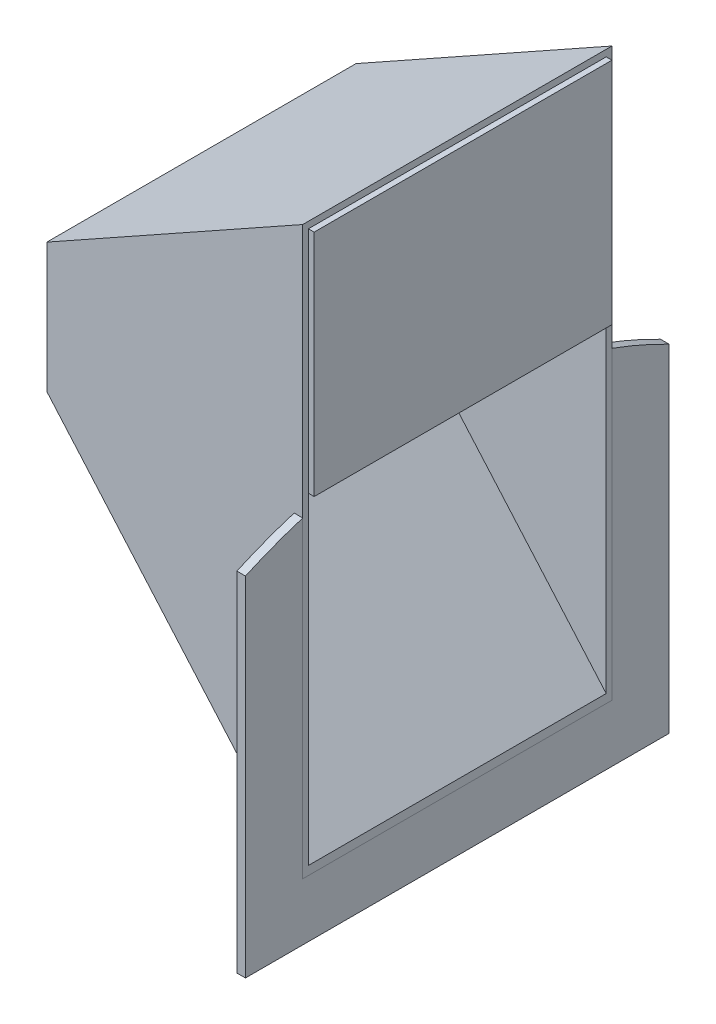
ISO-10303-21;
HEADER;
FILE_DESCRIPTION(('STEP AP214'),'2;1');
FILE_NAME('part.step','',(''),(''),'','','');
FILE_SCHEMA(('AUTOMOTIVE_DESIGN { 1 0 10303 214 1 1 1 1 }'));
ENDSEC;
DATA;
#1=APPLICATION_CONTEXT('core data for automotive mechanical design processes');
#2=APPLICATION_PROTOCOL_DEFINITION('international standard','automotive_design',2000,#1);
#3=PRODUCT_CONTEXT('',#1,'mechanical');
#4=PRODUCT('Part','Part','',(#3));
#5=PRODUCT_RELATED_PRODUCT_CATEGORY('part','',(#4));
#6=PRODUCT_DEFINITION_FORMATION('','',#4);
#7=PRODUCT_DEFINITION_CONTEXT('part definition',#1,'design');
#8=PRODUCT_DEFINITION('design','',#6,#7);
#9=PRODUCT_DEFINITION_SHAPE('','',#8);
#10=(LENGTH_UNIT() NAMED_UNIT(*) SI_UNIT(.MILLI.,.METRE.));
#11=(NAMED_UNIT(*) PLANE_ANGLE_UNIT() SI_UNIT($,.RADIAN.));
#12=(NAMED_UNIT(*) SI_UNIT($,.STERADIAN.) SOLID_ANGLE_UNIT());
#13=UNCERTAINTY_MEASURE_WITH_UNIT(LENGTH_MEASURE(1.E-05),#10,'distance_accuracy_value','');
#14=(GEOMETRIC_REPRESENTATION_CONTEXT(3) GLOBAL_UNCERTAINTY_ASSIGNED_CONTEXT((#13)) GLOBAL_UNIT_ASSIGNED_CONTEXT((#10,
#11,#12)) REPRESENTATION_CONTEXT('',''));
#15=CARTESIAN_POINT('',(0.,0.,0.));
#16=DIRECTION('',(0.,0.,1.));
#17=DIRECTION('',(1.,0.,0.));
#18=AXIS2_PLACEMENT_3D('',#15,#16,#17);
#19=CARTESIAN_POINT('',(-3.,16.5557235333864,0.));
#20=DIRECTION('',(0.,0.,1.));
#21=DIRECTION('',(1.,0.,0.));
#22=AXIS2_PLACEMENT_3D('',#19,#20,#21);
#23=PLANE('',#22);
#24=DIRECTION('',(0.,-1.,0.));
#25=VECTOR('',#24,1.);
#26=CARTESIAN_POINT('',(0.,16.5557235333864,0.));
#27=LINE('',#26,#25);
#28=CARTESIAN_POINT('',(0.,123.025196008159,0.));
#29=VERTEX_POINT('',#28);
#30=CARTESIAN_POINT('',(0.,16.5557235333864,0.));
#31=VERTEX_POINT('',#30);
#32=EDGE_CURVE('E143',#29,#31,#27,.T.);
#33=ORIENTED_EDGE('',*,*,#32,.F.);
#34=DIRECTION('',(1.,0.,0.));
#35=VECTOR('',#34,1.);
#36=CARTESIAN_POINT('',(-3.,123.025196008159,0.));
#37=LINE('',#36,#35);
#38=CARTESIAN_POINT('',(-3.,123.025196008159,0.));
#39=VERTEX_POINT('',#38);
#40=EDGE_CURVE('E12',#39,#29,#37,.T.);
#41=ORIENTED_EDGE('',*,*,#40,.F.);
#42=DIRECTION('',(0.,-1.,0.));
#43=VECTOR('',#42,1.);
#44=CARTESIAN_POINT('',(-3.,16.5557235333864,0.));
#45=LINE('',#44,#43);
#46=CARTESIAN_POINT('',(-3.,16.5557235333864,0.));
#47=VERTEX_POINT('',#46);
#48=EDGE_CURVE('E163',#39,#47,#45,.T.);
#49=ORIENTED_EDGE('',*,*,#48,.T.);
#50=DIRECTION('',(1.,0.,0.));
#51=VECTOR('',#50,1.);
#52=CARTESIAN_POINT('',(-3.,16.5557235333864,0.));
#53=LINE('',#52,#51);
#54=EDGE_CURVE('E49',#47,#31,#53,.T.);
#55=ORIENTED_EDGE('',*,*,#54,.T.);
#56=EDGE_LOOP('',(#33,#41,#49,#55));
#57=FACE_BOUND('',#56,.T.);
#58=ADVANCED_FACE('F46',(#57),#23,.T.);
#59=CARTESIAN_POINT('',(-3.,-36.7746788353462,58.));
#60=DIRECTION('',(1.,0.,0.));
#61=DIRECTION('',(0.,0.,-1.));
#62=AXIS2_PLACEMENT_3D('',#59,#60,#61);
#63=CYLINDRICAL_SURFACE('',#62,170.);
#64=CARTESIAN_POINT('',(0.,-36.7746788353462,58.));
#65=DIRECTION('',(1.,0.,0.));
#66=DIRECTION('',(0.,0.,-1.));
#67=AXIS2_PLACEMENT_3D('',#64,#65,#66);
#68=CIRCLE('',#67,170.);
#69=CARTESIAN_POINT('',(0.,114.274981872647,-20.));
#70=VERTEX_POINT('',#69);
#71=EDGE_CURVE('E161',#70,#29,#68,.T.);
#72=ORIENTED_EDGE('',*,*,#71,.F.);
#73=DIRECTION('',(1.,0.,0.));
#74=VECTOR('',#73,1.);
#75=CARTESIAN_POINT('',(-3.,114.274981872647,-20.));
#76=LINE('',#75,#74);
#77=CARTESIAN_POINT('',(-3.,114.274981872647,-20.));
#78=VERTEX_POINT('',#77);
#79=EDGE_CURVE('E55',#78,#70,#76,.T.);
#80=ORIENTED_EDGE('',*,*,#79,.F.);
#81=CARTESIAN_POINT('',(-3.,-36.7746788353462,58.));
#82=DIRECTION('',(1.,0.,0.));
#83=DIRECTION('',(0.,0.,-1.));
#84=AXIS2_PLACEMENT_3D('',#81,#82,#83);
#85=CIRCLE('',#84,170.);
#86=EDGE_CURVE('E133',#78,#39,#85,.T.);
#87=ORIENTED_EDGE('',*,*,#86,.T.);
#88=ORIENTED_EDGE('',*,*,#40,.T.);
#89=EDGE_LOOP('',(#72,#80,#87,#88));
#90=FACE_BOUND('',#89,.T.);
#91=ADVANCED_FACE('F175',(#90),#63,.T.);
#92=CARTESIAN_POINT('',(-3.,-3.44427646661359,-20.));
#93=DIRECTION('',(0.,0.,-1.));
#94=DIRECTION('',(0.,1.,0.));
#95=AXIS2_PLACEMENT_3D('',#92,#93,#94);
#96=PLANE('',#95);
#97=DIRECTION('',(0.,1.,0.));
#98=VECTOR('',#97,1.);
#99=CARTESIAN_POINT('',(0.,-3.44427646661359,-20.));
#100=LINE('',#99,#98);
#101=CARTESIAN_POINT('',(0.,-3.44427646661359,-20.));
#102=VERTEX_POINT('',#101);
#103=EDGE_CURVE('E120',#102,#70,#100,.T.);
#104=ORIENTED_EDGE('',*,*,#103,.F.);
#105=DIRECTION('',(1.,0.,0.));
#106=VECTOR('',#105,1.);
#107=CARTESIAN_POINT('',(-3.,-3.44427646661359,-20.));
#108=LINE('',#107,#106);
#109=CARTESIAN_POINT('',(-3.,-3.44427646661359,-20.));
#110=VERTEX_POINT('',#109);
#111=EDGE_CURVE('E115',#110,#102,#108,.T.);
#112=ORIENTED_EDGE('',*,*,#111,.F.);
#113=DIRECTION('',(0.,1.,0.));
#114=VECTOR('',#113,1.);
#115=CARTESIAN_POINT('',(-3.,-3.44427646661359,-20.));
#116=LINE('',#115,#114);
#117=EDGE_CURVE('E118',#110,#78,#116,.T.);
#118=ORIENTED_EDGE('',*,*,#117,.T.);
#119=ORIENTED_EDGE('',*,*,#79,.T.);
#120=EDGE_LOOP('',(#104,#112,#118,#119));
#121=FACE_BOUND('',#120,.T.);
#122=ADVANCED_FACE('F117',(#121),#96,.T.);
#123=CARTESIAN_POINT('',(-3.,-3.44427646661359,-20.));
#124=DIRECTION('',(0.,-1.,0.));
#125=DIRECTION('',(0.,0.,-1.));
#126=AXIS2_PLACEMENT_3D('',#123,#124,#125);
#127=PLANE('',#126);
#128=DIRECTION('',(0.,0.,-1.));
#129=VECTOR('',#128,1.);
#130=CARTESIAN_POINT('',(0.,-3.44427646661359,-20.));
#131=LINE('',#130,#129);
#132=CARTESIAN_POINT('',(0.,-3.4442764666136,128.));
#133=VERTEX_POINT('',#132);
#134=EDGE_CURVE('E158',#133,#102,#131,.T.);
#135=ORIENTED_EDGE('',*,*,#134,.F.);
#136=DIRECTION('',(1.,0.,0.));
#137=VECTOR('',#136,1.);
#138=CARTESIAN_POINT('',(-3.,-3.4442764666136,128.));
#139=LINE('',#138,#137);
#140=CARTESIAN_POINT('',(-3.,-3.4442764666136,128.));
#141=VERTEX_POINT('',#140);
#142=EDGE_CURVE('E125',#141,#133,#139,.T.);
#143=ORIENTED_EDGE('',*,*,#142,.F.);
#144=DIRECTION('',(0.,0.,-1.));
#145=VECTOR('',#144,1.);
#146=CARTESIAN_POINT('',(-3.,-3.44427646661359,-20.));
#147=LINE('',#146,#145);
#148=EDGE_CURVE('E131',#141,#110,#147,.T.);
#149=ORIENTED_EDGE('',*,*,#148,.T.);
#150=ORIENTED_EDGE('',*,*,#111,.T.);
#151=EDGE_LOOP('',(#135,#143,#149,#150));
#152=FACE_BOUND('',#151,.T.);
#153=ADVANCED_FACE('F135',(#152),#127,.T.);
#154=CARTESIAN_POINT('',(-3.,-3.4442764666136,128.));
#155=DIRECTION('',(0.,0.,1.));
#156=DIRECTION('',(1.,0.,0.));
#157=AXIS2_PLACEMENT_3D('',#154,#155,#156);
#158=PLANE('',#157);
#159=DIRECTION('',(0.,-1.,0.));
#160=VECTOR('',#159,1.);
#161=CARTESIAN_POINT('',(0.,-3.4442764666136,128.));
#162=LINE('',#161,#160);
#163=CARTESIAN_POINT('',(0.,118.14465501295,128.));
#164=VERTEX_POINT('',#163);
#165=EDGE_CURVE('E155',#164,#133,#162,.T.);
#166=ORIENTED_EDGE('',*,*,#165,.F.);
#167=DIRECTION('',(1.,0.,0.));
#168=VECTOR('',#167,1.);
#169=CARTESIAN_POINT('',(-3.,118.14465501295,128.));
#170=LINE('',#169,#168);
#171=CARTESIAN_POINT('',(-3.,118.14465501295,128.));
#172=VERTEX_POINT('',#171);
#173=EDGE_CURVE('E167',#172,#164,#170,.T.);
#174=ORIENTED_EDGE('',*,*,#173,.F.);
#175=DIRECTION('',(0.,-1.,0.));
#176=VECTOR('',#175,1.);
#177=CARTESIAN_POINT('',(-3.,-3.4442764666136,128.));
#178=LINE('',#177,#176);
#179=EDGE_CURVE('E136',#172,#141,#178,.T.);
#180=ORIENTED_EDGE('',*,*,#179,.T.);
#181=ORIENTED_EDGE('',*,*,#142,.T.);
#182=EDGE_LOOP('',(#166,#174,#180,#181));
#183=FACE_BOUND('',#182,.T.);
#184=ADVANCED_FACE('F188',(#183),#158,.T.);
#185=CARTESIAN_POINT('',(-3.,-36.7746788353462,58.));
#186=DIRECTION('',(1.,0.,0.));
#187=DIRECTION('',(0.,0.,-1.));
#188=AXIS2_PLACEMENT_3D('',#185,#186,#187);
#189=CYLINDRICAL_SURFACE('',#188,170.);
#190=CARTESIAN_POINT('',(0.,-36.7746788353462,58.));
#191=DIRECTION('',(1.,0.,0.));
#192=DIRECTION('',(0.,0.,-1.));
#193=AXIS2_PLACEMENT_3D('',#190,#191,#192);
#194=CIRCLE('',#193,170.);
#195=CARTESIAN_POINT('',(0.,125.706089257373,108.));
#196=VERTEX_POINT('',#195);
#197=EDGE_CURVE('E152',#196,#164,#194,.T.);
#198=ORIENTED_EDGE('',*,*,#197,.F.);
#199=DIRECTION('',(1.,0.,0.));
#200=VECTOR('',#199,1.);
#201=CARTESIAN_POINT('',(-3.,125.706089257373,108.));
#202=LINE('',#201,#200);
#203=CARTESIAN_POINT('',(-3.,125.706089257373,108.));
#204=VERTEX_POINT('',#203);
#205=EDGE_CURVE('E169',#204,#196,#202,.T.);
#206=ORIENTED_EDGE('',*,*,#205,.F.);
#207=CARTESIAN_POINT('',(-3.,-36.7746788353462,58.));
#208=DIRECTION('',(1.,0.,0.));
#209=DIRECTION('',(0.,0.,-1.));
#210=AXIS2_PLACEMENT_3D('',#207,#208,#209);
#211=CIRCLE('',#210,170.);
#212=EDGE_CURVE('E138',#204,#172,#211,.T.);
#213=ORIENTED_EDGE('',*,*,#212,.T.);
#214=ORIENTED_EDGE('',*,*,#173,.T.);
#215=EDGE_LOOP('',(#198,#206,#213,#214));
#216=FACE_BOUND('',#215,.T.);
#217=ADVANCED_FACE('F191',(#216),#189,.T.);
#218=CARTESIAN_POINT('',(-3.,16.5557235333864,108.));
#219=DIRECTION('',(0.,0.,-1.));
#220=DIRECTION('',(-1.,0.,0.));
#221=AXIS2_PLACEMENT_3D('',#218,#219,#220);
#222=PLANE('',#221);
#223=DIRECTION('',(0.,1.,0.));
#224=VECTOR('',#223,1.);
#225=CARTESIAN_POINT('',(0.,16.5557235333864,108.));
#226=LINE('',#225,#224);
#227=CARTESIAN_POINT('',(0.,16.5557235333864,108.));
#228=VERTEX_POINT('',#227);
#229=EDGE_CURVE('E149',#228,#196,#226,.T.);
#230=ORIENTED_EDGE('',*,*,#229,.F.);
#231=DIRECTION('',(1.,0.,0.));
#232=VECTOR('',#231,1.);
#233=CARTESIAN_POINT('',(-3.,16.5557235333864,108.));
#234=LINE('',#233,#232);
#235=CARTESIAN_POINT('',(-3.,16.5557235333864,108.));
#236=VERTEX_POINT('',#235);
#237=EDGE_CURVE('E170',#236,#228,#234,.T.);
#238=ORIENTED_EDGE('',*,*,#237,.F.);
#239=DIRECTION('',(0.,1.,0.));
#240=VECTOR('',#239,1.);
#241=CARTESIAN_POINT('',(-3.,16.5557235333864,108.));
#242=LINE('',#241,#240);
#243=EDGE_CURVE('E266',#236,#204,#242,.T.);
#244=ORIENTED_EDGE('',*,*,#243,.T.);
#245=ORIENTED_EDGE('',*,*,#205,.T.);
#246=EDGE_LOOP('',(#230,#238,#244,#245));
#247=FACE_BOUND('',#246,.T.);
#248=ADVANCED_FACE('F195',(#247),#222,.T.);
#249=CARTESIAN_POINT('',(-3.,16.5557235333864,0.));
#250=DIRECTION('',(0.,1.,0.));
#251=DIRECTION('',(0.,0.,1.));
#252=AXIS2_PLACEMENT_3D('',#249,#250,#251);
#253=PLANE('',#252);
#254=DIRECTION('',(0.,0.,1.));
#255=VECTOR('',#254,1.);
#256=CARTESIAN_POINT('',(0.,16.5557235333864,0.));
#257=LINE('',#256,#255);
#258=EDGE_CURVE('E146',#31,#228,#257,.T.);
#259=ORIENTED_EDGE('',*,*,#258,.F.);
#260=ORIENTED_EDGE('',*,*,#54,.F.);
#261=DIRECTION('',(0.,0.,1.));
#262=VECTOR('',#261,1.);
#263=CARTESIAN_POINT('',(-3.,16.5557235333864,0.));
#264=LINE('',#263,#262);
#265=EDGE_CURVE('E267',#47,#236,#264,.T.);
#266=ORIENTED_EDGE('',*,*,#265,.T.);
#267=ORIENTED_EDGE('',*,*,#237,.T.);
#268=EDGE_LOOP('',(#259,#260,#266,#267));
#269=FACE_BOUND('',#268,.T.);
#270=ADVANCED_FACE('F172',(#269),#253,.T.);
#271=CARTESIAN_POINT('',(-3.,-36.7746788353462,58.));
#272=DIRECTION('',(1.,0.,0.));
#273=DIRECTION('',(0.,0.,-1.));
#274=AXIS2_PLACEMENT_3D('',#271,#272,#273);
#275=PLANE('',#274);
#276=ORIENTED_EDGE('',*,*,#48,.F.);
#277=ORIENTED_EDGE('',*,*,#86,.F.);
#278=ORIENTED_EDGE('',*,*,#117,.F.);
#279=ORIENTED_EDGE('',*,*,#148,.F.);
#280=ORIENTED_EDGE('',*,*,#179,.F.);
#281=ORIENTED_EDGE('',*,*,#212,.F.);
#282=ORIENTED_EDGE('',*,*,#243,.F.);
#283=ORIENTED_EDGE('',*,*,#265,.F.);
#284=EDGE_LOOP('',(#276,#277,#278,#279,#280,#281,#282,#283));
#285=FACE_BOUND('',#284,.T.);
#286=ADVANCED_FACE('F129',(#285),#275,.F.);
#287=CARTESIAN_POINT('',(0.,-36.7746788353462,58.));
#288=DIRECTION('',(1.,0.,0.));
#289=DIRECTION('',(0.,0.,-1.));
#290=AXIS2_PLACEMENT_3D('',#287,#288,#289);
#291=PLANE('',#290);
#292=ORIENTED_EDGE('',*,*,#32,.T.);
#293=ORIENTED_EDGE('',*,*,#258,.T.);
#294=ORIENTED_EDGE('',*,*,#229,.T.);
#295=ORIENTED_EDGE('',*,*,#197,.T.);
#296=ORIENTED_EDGE('',*,*,#165,.T.);
#297=ORIENTED_EDGE('',*,*,#134,.T.);
#298=ORIENTED_EDGE('',*,*,#103,.T.);
#299=ORIENTED_EDGE('',*,*,#71,.T.);
#300=EDGE_LOOP('',(#292,#293,#294,#295,#296,#297,#298,#299));
#301=FACE_BOUND('',#300,.T.);
#302=ADVANCED_FACE('F174',(#301),#291,.T.);
#303=CLOSED_SHELL('',(#58,#91,#122,#153,#184,#217,#248,#270,#286,#302));
#304=MANIFOLD_SOLID_BREP('B2',#303);
#305=CARTESIAN_POINT('',(2.,212.179620919392,0.));
#306=DIRECTION('',(0.,1.,0.));
#307=DIRECTION('',(0.,0.,1.));
#308=AXIS2_PLACEMENT_3D('',#305,#306,#307);
#309=PLANE('',#308);
#310=DIRECTION('',(0.,0.,-1.));
#311=VECTOR('',#310,1.);
#312=CARTESIAN_POINT('',(0.,212.179620919392,0.));
#313=LINE('',#312,#311);
#314=CARTESIAN_POINT('',(0.,212.179620919392,106.));
#315=VERTEX_POINT('',#314);
#316=CARTESIAN_POINT('',(0.,212.179620919392,2.));
#317=VERTEX_POINT('',#316);
#318=EDGE_CURVE('E346',#315,#317,#313,.T.);
#319=ORIENTED_EDGE('',*,*,#318,.F.);
#320=DIRECTION('',(-1.,0.,0.));
#321=VECTOR('',#320,1.);
#322=CARTESIAN_POINT('',(2.,212.179620919392,106.));
#323=LINE('',#322,#321);
#324=CARTESIAN_POINT('',(2.,212.179620919392,106.));
#325=VERTEX_POINT('',#324);
#326=EDGE_CURVE('E44',#325,#315,#323,.T.);
#327=ORIENTED_EDGE('',*,*,#326,.F.);
#328=DIRECTION('',(0.,0.,-1.));
#329=VECTOR('',#328,1.);
#330=CARTESIAN_POINT('',(2.,212.179620919392,0.));
#331=LINE('',#330,#329);
#332=CARTESIAN_POINT('',(2.,212.179620919392,2.));
#333=VERTEX_POINT('',#332);
#334=EDGE_CURVE('E338',#325,#333,#331,.T.);
#335=ORIENTED_EDGE('',*,*,#334,.T.);
#336=DIRECTION('',(-1.,0.,0.));
#337=VECTOR('',#336,1.);
#338=CARTESIAN_POINT('',(2.,212.179620919392,2.));
#339=LINE('',#338,#337);
#340=EDGE_CURVE('E299',#333,#317,#339,.T.);
#341=ORIENTED_EDGE('',*,*,#340,.T.);
#342=EDGE_LOOP('',(#319,#327,#335,#341));
#343=FACE_BOUND('',#342,.T.);
#344=ADVANCED_FACE('F283',(#343),#309,.T.);
#345=CARTESIAN_POINT('',(2.,0.,106.));
#346=DIRECTION('',(0.,0.,1.));
#347=DIRECTION('',(1.,0.,0.));
#348=AXIS2_PLACEMENT_3D('',#345,#346,#347);
#349=PLANE('',#348);
#350=DIRECTION('',(0.,1.,0.));
#351=VECTOR('',#350,1.);
#352=CARTESIAN_POINT('',(0.,0.,106.));
#353=LINE('',#352,#351);
#354=CARTESIAN_POINT('',(0.,132.179620919392,106.));
#355=VERTEX_POINT('',#354);
#356=EDGE_CURVE('E329',#355,#315,#353,.T.);
#357=ORIENTED_EDGE('',*,*,#356,.F.);
#358=DIRECTION('',(-1.,0.,0.));
#359=VECTOR('',#358,1.);
#360=CARTESIAN_POINT('',(2.,132.179620919392,106.));
#361=LINE('',#360,#359);
#362=CARTESIAN_POINT('',(2.,132.179620919392,106.));
#363=VERTEX_POINT('',#362);
#364=EDGE_CURVE('E291',#363,#355,#361,.T.);
#365=ORIENTED_EDGE('',*,*,#364,.F.);
#366=DIRECTION('',(0.,1.,0.));
#367=VECTOR('',#366,1.);
#368=CARTESIAN_POINT('',(2.,0.,106.));
#369=LINE('',#368,#367);
#370=EDGE_CURVE('E327',#363,#325,#369,.T.);
#371=ORIENTED_EDGE('',*,*,#370,.T.);
#372=ORIENTED_EDGE('',*,*,#326,.T.);
#373=EDGE_LOOP('',(#357,#365,#371,#372));
#374=FACE_BOUND('',#373,.T.);
#375=ADVANCED_FACE('F326',(#374),#349,.T.);
#376=CARTESIAN_POINT('',(2.,132.179620919392,0.));
#377=DIRECTION('',(0.,-1.,0.));
#378=DIRECTION('',(0.,0.,-1.));
#379=AXIS2_PLACEMENT_3D('',#376,#377,#378);
#380=PLANE('',#379);
#381=DIRECTION('',(0.,0.,1.));
#382=VECTOR('',#381,1.);
#383=CARTESIAN_POINT('',(0.,132.179620919392,0.));
#384=LINE('',#383,#382);
#385=CARTESIAN_POINT('',(0.,132.179620919392,2.));
#386=VERTEX_POINT('',#385);
#387=EDGE_CURVE('E349',#386,#355,#384,.T.);
#388=ORIENTED_EDGE('',*,*,#387,.F.);
#389=DIRECTION('',(-1.,0.,0.));
#390=VECTOR('',#389,1.);
#391=CARTESIAN_POINT('',(2.,132.179620919392,2.));
#392=LINE('',#391,#390);
#393=CARTESIAN_POINT('',(2.,132.179620919392,2.));
#394=VERTEX_POINT('',#393);
#395=EDGE_CURVE('E312',#394,#386,#392,.T.);
#396=ORIENTED_EDGE('',*,*,#395,.F.);
#397=DIRECTION('',(0.,0.,1.));
#398=VECTOR('',#397,1.);
#399=CARTESIAN_POINT('',(2.,132.179620919392,0.));
#400=LINE('',#399,#398);
#401=EDGE_CURVE('E337',#394,#363,#400,.T.);
#402=ORIENTED_EDGE('',*,*,#401,.T.);
#403=ORIENTED_EDGE('',*,*,#364,.T.);
#404=EDGE_LOOP('',(#388,#396,#402,#403));
#405=FACE_BOUND('',#404,.T.);
#406=ADVANCED_FACE('F340',(#405),#380,.T.);
#407=CARTESIAN_POINT('',(2.,0.,2.));
#408=DIRECTION('',(0.,0.,-1.));
#409=DIRECTION('',(-1.,0.,0.));
#410=AXIS2_PLACEMENT_3D('',#407,#408,#409);
#411=PLANE('',#410);
#412=DIRECTION('',(0.,-1.,0.));
#413=VECTOR('',#412,1.);
#414=CARTESIAN_POINT('',(0.,0.,2.));
#415=LINE('',#414,#413);
#416=EDGE_CURVE('E351',#317,#386,#415,.T.);
#417=ORIENTED_EDGE('',*,*,#416,.F.);
#418=ORIENTED_EDGE('',*,*,#340,.F.);
#419=DIRECTION('',(0.,-1.,0.));
#420=VECTOR('',#419,1.);
#421=CARTESIAN_POINT('',(2.,0.,2.));
#422=LINE('',#421,#420);
#423=EDGE_CURVE('E341',#333,#394,#422,.T.);
#424=ORIENTED_EDGE('',*,*,#423,.T.);
#425=ORIENTED_EDGE('',*,*,#395,.T.);
#426=EDGE_LOOP('',(#417,#418,#424,#425));
#427=FACE_BOUND('',#426,.T.);
#428=ADVANCED_FACE('F356',(#427),#411,.T.);
#429=CARTESIAN_POINT('',(2.,0.,0.));
#430=DIRECTION('',(1.,0.,0.));
#431=DIRECTION('',(0.,0.,-1.));
#432=AXIS2_PLACEMENT_3D('',#429,#430,#431);
#433=PLANE('',#432);
#434=ORIENTED_EDGE('',*,*,#334,.F.);
#435=ORIENTED_EDGE('',*,*,#370,.F.);
#436=ORIENTED_EDGE('',*,*,#401,.F.);
#437=ORIENTED_EDGE('',*,*,#423,.F.);
#438=EDGE_LOOP('',(#434,#435,#436,#437));
#439=FACE_BOUND('',#438,.T.);
#440=ADVANCED_FACE('F335',(#439),#433,.T.);
#441=CARTESIAN_POINT('',(0.,0.,0.));
#442=DIRECTION('',(1.,0.,0.));
#443=DIRECTION('',(0.,0.,-1.));
#444=AXIS2_PLACEMENT_3D('',#441,#442,#443);
#445=PLANE('',#444);
#446=ORIENTED_EDGE('',*,*,#318,.T.);
#447=ORIENTED_EDGE('',*,*,#416,.T.);
#448=ORIENTED_EDGE('',*,*,#387,.T.);
#449=ORIENTED_EDGE('',*,*,#356,.T.);
#450=EDGE_LOOP('',(#446,#447,#448,#449));
#451=FACE_BOUND('',#450,.T.);
#452=ADVANCED_FACE('F363',(#451),#445,.F.);
#453=CLOSED_SHELL('',(#344,#375,#406,#428,#440,#452));
#454=MANIFOLD_SOLID_BREP('B6',#453);
#455=CARTESIAN_POINT('',(0.,214.471385382278,108.));
#456=DIRECTION('',(-1.,0.,0.));
#457=DIRECTION('',(0.,0.,1.));
#458=AXIS2_PLACEMENT_3D('',#455,#456,#457);
#459=PLANE('',#458);
#460=DIRECTION('',(0.,1.,0.));
#461=VECTOR('',#460,1.);
#462=CARTESIAN_POINT('',(0.,214.471385382278,0.));
#463=LINE('',#462,#461);
#464=CARTESIAN_POINT('',(0.,16.5557235333864,0.));
#465=VERTEX_POINT('',#464);
#466=CARTESIAN_POINT('',(0.,214.471385382278,0.));
#467=VERTEX_POINT('',#466);
#468=EDGE_CURVE('E543',#465,#467,#463,.T.);
#469=ORIENTED_EDGE('',*,*,#468,.T.);
#470=DIRECTION('',(0.,0.,-1.));
#471=VECTOR('',#470,1.);
#472=CARTESIAN_POINT('',(0.,214.471385382278,108.));
#473=LINE('',#472,#471);
#474=CARTESIAN_POINT('',(0.,214.471385382278,108.));
#475=VERTEX_POINT('',#474);
#476=EDGE_CURVE('E281',#475,#467,#473,.T.);
#477=ORIENTED_EDGE('',*,*,#476,.F.);
#478=DIRECTION('',(0.,1.,0.));
#479=VECTOR('',#478,1.);
#480=CARTESIAN_POINT('',(0.,214.471385382278,108.));
#481=LINE('',#480,#479);
#482=CARTESIAN_POINT('',(0.,16.5557235333864,108.));
#483=VERTEX_POINT('',#482);
#484=EDGE_CURVE('E548',#483,#475,#481,.T.);
#485=ORIENTED_EDGE('',*,*,#484,.F.);
#486=DIRECTION('',(0.,0.,-1.));
#487=VECTOR('',#486,1.);
#488=CARTESIAN_POINT('',(0.,16.5557235333864,108.));
#489=LINE('',#488,#487);
#490=EDGE_CURVE('E554',#483,#465,#489,.T.);
#491=ORIENTED_EDGE('',*,*,#490,.T.);
#492=EDGE_LOOP('',(#469,#477,#485,#491));
#493=FACE_BOUND('',#492,.T.);
#494=DIRECTION('',(0.,1.,0.));
#495=VECTOR('',#494,1.);
#496=CARTESIAN_POINT('',(0.,0.,2.));
#497=LINE('',#496,#495);
#498=CARTESIAN_POINT('',(0.,19.6023514438199,2.));
#499=VERTEX_POINT('',#498);
#500=CARTESIAN_POINT('',(0.,212.179620919392,2.));
#501=VERTEX_POINT('',#500);
#502=EDGE_CURVE('E514',#499,#501,#497,.T.);
#503=ORIENTED_EDGE('',*,*,#502,.F.);
#504=DIRECTION('',(0.,0.,-1.));
#505=VECTOR('',#504,1.);
#506=CARTESIAN_POINT('',(0.,19.6023514438199,108.));
#507=LINE('',#506,#505);
#508=CARTESIAN_POINT('',(0.,19.6023514438199,106.));
#509=VERTEX_POINT('',#508);
#510=EDGE_CURVE('E537',#509,#499,#507,.T.);
#511=ORIENTED_EDGE('',*,*,#510,.F.);
#512=DIRECTION('',(0.,1.,0.));
#513=VECTOR('',#512,1.);
#514=CARTESIAN_POINT('',(0.,0.,106.));
#515=LINE('',#514,#513);
#516=CARTESIAN_POINT('',(0.,212.179620919392,106.));
#517=VERTEX_POINT('',#516);
#518=EDGE_CURVE('E448',#509,#517,#515,.T.);
#519=ORIENTED_EDGE('',*,*,#518,.T.);
#520=DIRECTION('',(0.,0.,-1.));
#521=VECTOR('',#520,1.);
#522=CARTESIAN_POINT('',(0.,212.179620919392,108.));
#523=LINE('',#522,#521);
#524=EDGE_CURVE('E525',#517,#501,#523,.T.);
#525=ORIENTED_EDGE('',*,*,#524,.T.);
#526=EDGE_LOOP('',(#503,#511,#519,#525));
#527=FACE_BOUND('',#526,.T.);
#528=ADVANCED_FACE('F434',(#493,#527),#459,.F.);
#529=CARTESIAN_POINT('',(0.,214.471385382278,108.));
#530=DIRECTION('',(0.488274625508617,-0.872690030929894,0.));
#531=DIRECTION('',(0.872690030929894,0.488274625508617,0.));
#532=AXIS2_PLACEMENT_3D('',#529,#530,#531);
#533=PLANE('',#532);
#534=DIRECTION('',(-0.872690030929894,-0.488274625508617,0.));
#535=VECTOR('',#534,1.);
#536=CARTESIAN_POINT('',(0.,214.471385382278,0.));
#537=LINE('',#536,#535);
#538=CARTESIAN_POINT('',(-89.379106020747,164.463309234011,0.));
#539=VERTEX_POINT('',#538);
#540=EDGE_CURVE('E557',#467,#539,#537,.T.);
#541=ORIENTED_EDGE('',*,*,#540,.T.);
#542=DIRECTION('',(0.,0.,-1.));
#543=VECTOR('',#542,1.);
#544=CARTESIAN_POINT('',(-89.379106020747,164.463309234011,108.));
#545=LINE('',#544,#543);
#546=CARTESIAN_POINT('',(-89.379106020747,164.463309234011,108.));
#547=VERTEX_POINT('',#546);
#548=EDGE_CURVE('E441',#547,#539,#545,.T.);
#549=ORIENTED_EDGE('',*,*,#548,.F.);
#550=DIRECTION('',(-0.872690030929894,-0.488274625508617,0.));
#551=VECTOR('',#550,1.);
#552=CARTESIAN_POINT('',(0.,214.471385382278,108.));
#553=LINE('',#552,#551);
#554=EDGE_CURVE('E485',#475,#547,#553,.T.);
#555=ORIENTED_EDGE('',*,*,#554,.F.);
#556=ORIENTED_EDGE('',*,*,#476,.T.);
#557=EDGE_LOOP('',(#541,#549,#555,#556));
#558=FACE_BOUND('',#557,.T.);
#559=ADVANCED_FACE('F586',(#558),#533,.F.);
#560=CARTESIAN_POINT('',(-89.379106020747,164.463309234011,108.));
#561=DIRECTION('',(1.,0.,0.));
#562=DIRECTION('',(0.,0.,-1.));
#563=AXIS2_PLACEMENT_3D('',#560,#561,#562);
#564=PLANE('',#563);
#565=DIRECTION('',(0.,-1.,0.));
#566=VECTOR('',#565,1.);
#567=CARTESIAN_POINT('',(-89.379106020747,164.463309234011,0.));
#568=LINE('',#567,#566);
#569=CARTESIAN_POINT('',(-89.379106020747,119.263377534546,0.));
#570=VERTEX_POINT('',#569);
#571=EDGE_CURVE('E559',#539,#570,#568,.T.);
#572=ORIENTED_EDGE('',*,*,#571,.T.);
#573=DIRECTION('',(0.,0.,-1.));
#574=VECTOR('',#573,1.);
#575=CARTESIAN_POINT('',(-89.379106020747,119.263377534546,108.));
#576=LINE('',#575,#574);
#577=CARTESIAN_POINT('',(-89.379106020747,119.263377534546,108.));
#578=VERTEX_POINT('',#577);
#579=EDGE_CURVE('E563',#578,#570,#576,.T.);
#580=ORIENTED_EDGE('',*,*,#579,.F.);
#581=DIRECTION('',(0.,-1.,0.));
#582=VECTOR('',#581,1.);
#583=CARTESIAN_POINT('',(-89.379106020747,164.463309234011,108.));
#584=LINE('',#583,#582);
#585=EDGE_CURVE('E551',#547,#578,#584,.T.);
#586=ORIENTED_EDGE('',*,*,#585,.F.);
#587=ORIENTED_EDGE('',*,*,#548,.T.);
#588=EDGE_LOOP('',(#572,#580,#586,#587));
#589=FACE_BOUND('',#588,.T.);
#590=ADVANCED_FACE('F568',(#589),#564,.F.);
#591=CARTESIAN_POINT('',(0.,16.5557235333864,108.));
#592=DIRECTION('',(0.754357794642976,0.656463493014947,0.));
#593=DIRECTION('',(-0.656463493014947,0.754357794642976,0.));
#594=AXIS2_PLACEMENT_3D('',#591,#592,#593);
#595=PLANE('',#594);
#596=DIRECTION('',(0.656463493014947,-0.754357794642976,0.));
#597=VECTOR('',#596,1.);
#598=CARTESIAN_POINT('',(0.,16.5557235333864,0.));
#599=LINE('',#598,#597);
#600=EDGE_CURVE('E478',#570,#465,#599,.T.);
#601=ORIENTED_EDGE('',*,*,#600,.T.);
#602=ORIENTED_EDGE('',*,*,#490,.F.);
#603=DIRECTION('',(0.656463493014947,-0.754357794642976,0.));
#604=VECTOR('',#603,1.);
#605=CARTESIAN_POINT('',(0.,16.5557235333864,108.));
#606=LINE('',#605,#604);
#607=EDGE_CURVE('E457',#578,#483,#606,.T.);
#608=ORIENTED_EDGE('',*,*,#607,.F.);
#609=ORIENTED_EDGE('',*,*,#579,.T.);
#610=EDGE_LOOP('',(#601,#602,#608,#609));
#611=FACE_BOUND('',#610,.T.);
#612=ADVANCED_FACE('F577',(#611),#595,.F.);
#613=CARTESIAN_POINT('',(0.,0.,108.));
#614=DIRECTION('',(0.,0.,-1.));
#615=DIRECTION('',(-1.,0.,0.));
#616=AXIS2_PLACEMENT_3D('',#613,#614,#615);
#617=PLANE('',#616);
#618=ORIENTED_EDGE('',*,*,#484,.T.);
#619=ORIENTED_EDGE('',*,*,#554,.T.);
#620=ORIENTED_EDGE('',*,*,#585,.T.);
#621=ORIENTED_EDGE('',*,*,#607,.T.);
#622=EDGE_LOOP('',(#618,#619,#620,#621));
#623=FACE_BOUND('',#622,.T.);
#624=ADVANCED_FACE('F579',(#623),#617,.F.);
#625=CARTESIAN_POINT('',(0.,0.,0.));
#626=DIRECTION('',(0.,0.,-1.));
#627=DIRECTION('',(-1.,0.,0.));
#628=AXIS2_PLACEMENT_3D('',#625,#626,#627);
#629=PLANE('',#628);
#630=ORIENTED_EDGE('',*,*,#468,.F.);
#631=ORIENTED_EDGE('',*,*,#600,.F.);
#632=ORIENTED_EDGE('',*,*,#571,.F.);
#633=ORIENTED_EDGE('',*,*,#540,.F.);
#634=EDGE_LOOP('',(#630,#631,#632,#633));
#635=FACE_BOUND('',#634,.T.);
#636=ADVANCED_FACE('F572',(#635),#629,.T.);
#637=CARTESIAN_POINT('',(0.976549251017235,212.726005320418,108.));
#638=DIRECTION('',(0.488274625508617,-0.872690030929894,0.));
#639=DIRECTION('',(0.872690030929894,0.488274625508617,0.));
#640=AXIS2_PLACEMENT_3D('',#637,#638,#639);
#641=PLANE('',#640);
#642=DIRECTION('',(-0.872690030929894,-0.488274625508617,0.));
#643=VECTOR('',#642,1.);
#644=CARTESIAN_POINT('',(-90.4123670846281,161.593429814912,2.));
#645=LINE('',#644,#643);
#646=CARTESIAN_POINT('',(-87.379106020747,163.290555205995,2.));
#647=VERTEX_POINT('',#646);
#648=EDGE_CURVE('E507',#501,#647,#645,.T.);
#649=ORIENTED_EDGE('',*,*,#648,.F.);
#650=ORIENTED_EDGE('',*,*,#524,.F.);
#651=DIRECTION('',(-0.872690030929894,-0.488274625508617,0.));
#652=VECTOR('',#651,1.);
#653=CARTESIAN_POINT('',(-90.4123670846281,161.593429814912,106.));
#654=LINE('',#653,#652);
#655=CARTESIAN_POINT('',(-87.379106020747,163.290555205995,106.));
#656=VERTEX_POINT('',#655);
#657=EDGE_CURVE('E522',#517,#656,#654,.T.);
#658=ORIENTED_EDGE('',*,*,#657,.T.);
#659=DIRECTION('',(0.,0.,-1.));
#660=VECTOR('',#659,1.);
#661=CARTESIAN_POINT('',(-87.379106020747,163.290555205995,108.));
#662=LINE('',#661,#660);
#663=EDGE_CURVE('E520',#656,#647,#662,.T.);
#664=ORIENTED_EDGE('',*,*,#663,.T.);
#665=EDGE_LOOP('',(#649,#650,#658,#664));
#666=FACE_BOUND('',#665,.T.);
#667=ADVANCED_FACE('F521',(#666),#641,.T.);
#668=CARTESIAN_POINT('',(-87.379106020747,164.463309234011,108.));
#669=DIRECTION('',(1.,0.,0.));
#670=DIRECTION('',(0.,0.,-1.));
#671=AXIS2_PLACEMENT_3D('',#668,#669,#670);
#672=PLANE('',#671);
#673=DIRECTION('',(0.,-1.,0.));
#674=VECTOR('',#673,1.);
#675=CARTESIAN_POINT('',(-87.379106020747,0.,2.));
#676=LINE('',#675,#674);
#677=CARTESIAN_POINT('',(-87.379106020747,120.011757933367,2.));
#678=VERTEX_POINT('',#677);
#679=EDGE_CURVE('E511',#647,#678,#676,.T.);
#680=ORIENTED_EDGE('',*,*,#679,.F.);
#681=ORIENTED_EDGE('',*,*,#663,.F.);
#682=DIRECTION('',(0.,-1.,0.));
#683=VECTOR('',#682,1.);
#684=CARTESIAN_POINT('',(-87.379106020747,0.,106.));
#685=LINE('',#684,#683);
#686=CARTESIAN_POINT('',(-87.379106020747,120.011757933367,106.));
#687=VERTEX_POINT('',#686);
#688=EDGE_CURVE('E538',#656,#687,#685,.T.);
#689=ORIENTED_EDGE('',*,*,#688,.T.);
#690=DIRECTION('',(0.,0.,-1.));
#691=VECTOR('',#690,1.);
#692=CARTESIAN_POINT('',(-87.379106020747,120.011757933367,108.));
#693=LINE('',#692,#691);
#694=EDGE_CURVE('E526',#687,#678,#693,.T.);
#695=ORIENTED_EDGE('',*,*,#694,.T.);
#696=EDGE_LOOP('',(#680,#681,#689,#695));
#697=FACE_BOUND('',#696,.T.);
#698=ADVANCED_FACE('F528',(#697),#672,.T.);
#699=CARTESIAN_POINT('',(1.50871558928595,17.8686505194163,108.));
#700=DIRECTION('',(0.754357794642976,0.656463493014947,0.));
#701=DIRECTION('',(-0.656463493014947,0.754357794642976,0.));
#702=AXIS2_PLACEMENT_3D('',#699,#700,#701);
#703=PLANE('',#702);
#704=DIRECTION('',(0.656463493014947,-0.754357794642976,0.));
#705=VECTOR('',#704,1.);
#706=CARTESIAN_POINT('',(9.70724817056674,8.44752196751564,2.));
#707=LINE('',#706,#705);
#708=EDGE_CURVE('E531',#678,#499,#707,.T.);
#709=ORIENTED_EDGE('',*,*,#708,.F.);
#710=ORIENTED_EDGE('',*,*,#694,.F.);
#711=DIRECTION('',(0.656463493014947,-0.754357794642976,0.));
#712=VECTOR('',#711,1.);
#713=CARTESIAN_POINT('',(9.70724817056674,8.44752196751564,106.));
#714=LINE('',#713,#712);
#715=EDGE_CURVE('E539',#687,#509,#714,.T.);
#716=ORIENTED_EDGE('',*,*,#715,.T.);
#717=ORIENTED_EDGE('',*,*,#510,.T.);
#718=EDGE_LOOP('',(#709,#710,#716,#717));
#719=FACE_BOUND('',#718,.T.);
#720=ADVANCED_FACE('F637',(#719),#703,.T.);
#721=CARTESIAN_POINT('',(0.,0.,106.));
#722=DIRECTION('',(0.,0.,-1.));
#723=DIRECTION('',(-1.,0.,0.));
#724=AXIS2_PLACEMENT_3D('',#721,#722,#723);
#725=PLANE('',#724);
#726=ORIENTED_EDGE('',*,*,#518,.F.);
#727=ORIENTED_EDGE('',*,*,#715,.F.);
#728=ORIENTED_EDGE('',*,*,#688,.F.);
#729=ORIENTED_EDGE('',*,*,#657,.F.);
#730=EDGE_LOOP('',(#726,#727,#728,#729));
#731=FACE_BOUND('',#730,.T.);
#732=ADVANCED_FACE('F646',(#731),#725,.T.);
#733=CARTESIAN_POINT('',(0.,0.,2.));
#734=DIRECTION('',(0.,0.,-1.));
#735=DIRECTION('',(-1.,0.,0.));
#736=AXIS2_PLACEMENT_3D('',#733,#734,#735);
#737=PLANE('',#736);
#738=ORIENTED_EDGE('',*,*,#502,.T.);
#739=ORIENTED_EDGE('',*,*,#648,.T.);
#740=ORIENTED_EDGE('',*,*,#679,.T.);
#741=ORIENTED_EDGE('',*,*,#708,.T.);
#742=EDGE_LOOP('',(#738,#739,#740,#741));
#743=FACE_BOUND('',#742,.T.);
#744=ADVANCED_FACE('F509',(#743),#737,.F.);
#745=CLOSED_SHELL('',(#528,#559,#590,#612,#624,#636,#667,#698,#720,#732,#744));
#746=MANIFOLD_SOLID_BREP('B38',#745);
#747=ADVANCED_BREP_SHAPE_REPRESENTATION('',(#18,#304,#454,#746),#14);
#748=SHAPE_DEFINITION_REPRESENTATION(#9,#747);
ENDSEC;
END-ISO-10303-21;
